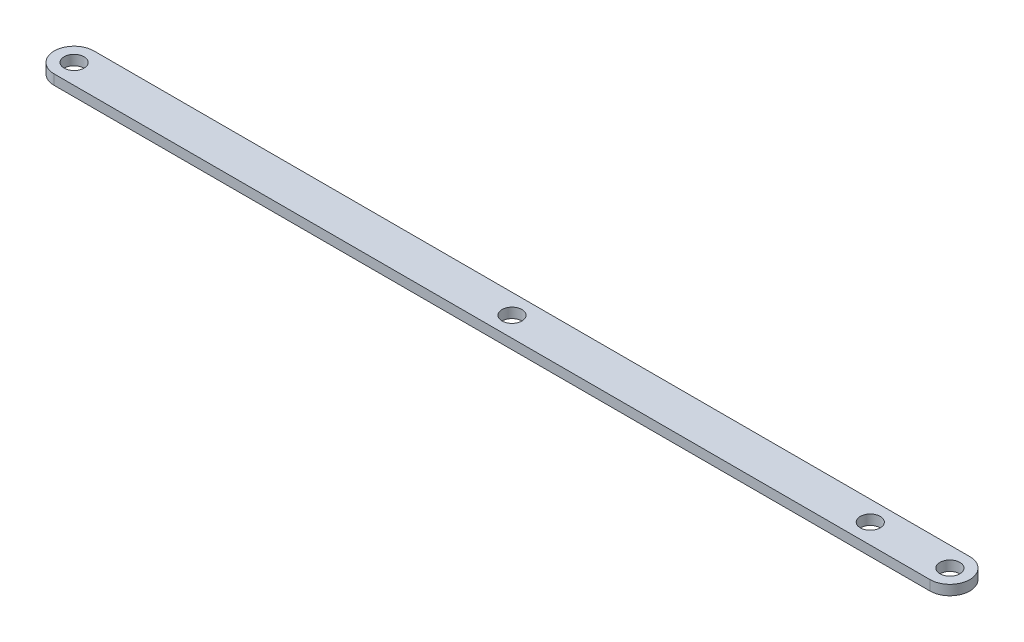
ISO-10303-21;
HEADER;
FILE_DESCRIPTION(('STEP AP214'),'2;1');
FILE_NAME('part.step','',(''),(''),'','','');
FILE_SCHEMA(('AUTOMOTIVE_DESIGN { 1 0 10303 214 1 1 1 1 }'));
ENDSEC;
DATA;
#1=APPLICATION_CONTEXT('core data for automotive mechanical design processes');
#2=APPLICATION_PROTOCOL_DEFINITION('international standard','automotive_design',2000,#1);
#3=PRODUCT_CONTEXT('',#1,'mechanical');
#4=PRODUCT('Part','Part','',(#3));
#5=PRODUCT_RELATED_PRODUCT_CATEGORY('part','',(#4));
#6=PRODUCT_DEFINITION_FORMATION('','',#4);
#7=PRODUCT_DEFINITION_CONTEXT('part definition',#1,'design');
#8=PRODUCT_DEFINITION('design','',#6,#7);
#9=PRODUCT_DEFINITION_SHAPE('','',#8);
#10=(LENGTH_UNIT() NAMED_UNIT(*) SI_UNIT(.MILLI.,.METRE.));
#11=(NAMED_UNIT(*) PLANE_ANGLE_UNIT() SI_UNIT($,.RADIAN.));
#12=(NAMED_UNIT(*) SI_UNIT($,.STERADIAN.) SOLID_ANGLE_UNIT());
#13=UNCERTAINTY_MEASURE_WITH_UNIT(LENGTH_MEASURE(1.E-05),#10,'distance_accuracy_value','');
#14=(GEOMETRIC_REPRESENTATION_CONTEXT(3) GLOBAL_UNCERTAINTY_ASSIGNED_CONTEXT((#13)) GLOBAL_UNIT_ASSIGNED_CONTEXT((#10,
#11,#12)) REPRESENTATION_CONTEXT('',''));
#15=CARTESIAN_POINT('',(0.,0.,0.));
#16=DIRECTION('',(0.,0.,1.));
#17=DIRECTION('',(1.,0.,0.));
#18=AXIS2_PLACEMENT_3D('',#15,#16,#17);
#19=CARTESIAN_POINT('',(-72.3468097091892,5.,0.));
#20=DIRECTION('',(0.,1.,0.));
#21=DIRECTION('',(0.,0.,1.));
#22=AXIS2_PLACEMENT_3D('',#19,#20,#21);
#23=PLANE('',#22);
#24=CARTESIAN_POINT('',(327.653190290811,5.,0.));
#25=DIRECTION('',(0.,1.,0.));
#26=DIRECTION('',(0.,0.,1.));
#27=AXIS2_PLACEMENT_3D('',#24,#25,#26);
#28=CIRCLE('',#27,4.99999999999999);
#29=CARTESIAN_POINT('',(327.653190290811,5.,4.99999999999999));
#30=VERTEX_POINT('',#29);
#31=EDGE_CURVE('E131',#30,#30,#28,.T.);
#32=ORIENTED_EDGE('',*,*,#31,.F.);
#33=EDGE_LOOP('',(#32));
#34=FACE_BOUND('',#33,.T.);
#35=CARTESIAN_POINT('',(147.653190290811,5.,0.));
#36=DIRECTION('',(0.,1.,0.));
#37=DIRECTION('',(0.,0.,1.));
#38=AXIS2_PLACEMENT_3D('',#35,#36,#37);
#39=CIRCLE('',#38,4.99999999999999);
#40=CARTESIAN_POINT('',(147.653190290811,5.,4.99999999999999));
#41=VERTEX_POINT('',#40);
#42=EDGE_CURVE('E139',#41,#41,#39,.T.);
#43=ORIENTED_EDGE('',*,*,#42,.F.);
#44=EDGE_LOOP('',(#43));
#45=FACE_BOUND('',#44,.T.);
#46=CARTESIAN_POINT('',(-72.3468097091892,5.,0.));
#47=DIRECTION('',(0.,1.,0.));
#48=DIRECTION('',(0.,0.,1.));
#49=AXIS2_PLACEMENT_3D('',#46,#47,#48);
#50=CIRCLE('',#49,5.);
#51=CARTESIAN_POINT('',(-72.3468097091892,5.,5.));
#52=VERTEX_POINT('',#51);
#53=EDGE_CURVE('E118',#52,#52,#50,.T.);
#54=ORIENTED_EDGE('',*,*,#53,.F.);
#55=EDGE_LOOP('',(#54));
#56=FACE_BOUND('',#55,.T.);
#57=CARTESIAN_POINT('',(-72.3468097091892,5.,0.));
#58=DIRECTION('',(0.,1.,0.));
#59=DIRECTION('',(0.,0.,1.));
#60=AXIS2_PLACEMENT_3D('',#57,#58,#59);
#61=CIRCLE('',#60,10.);
#62=CARTESIAN_POINT('',(-72.3468097091892,5.,-10.));
#63=VERTEX_POINT('',#62);
#64=CARTESIAN_POINT('',(-72.3468097091892,5.,10.));
#65=VERTEX_POINT('',#64);
#66=EDGE_CURVE('E97',#63,#65,#61,.T.);
#67=ORIENTED_EDGE('',*,*,#66,.T.);
#68=DIRECTION('',(1.,0.,0.));
#69=VECTOR('',#68,1.);
#70=CARTESIAN_POINT('',(-72.3468097091892,5.,10.));
#71=LINE('',#70,#69);
#72=CARTESIAN_POINT('',(367.653190290811,5.,10.));
#73=VERTEX_POINT('',#72);
#74=EDGE_CURVE('E92',#65,#73,#71,.T.);
#75=ORIENTED_EDGE('',*,*,#74,.T.);
#76=CARTESIAN_POINT('',(367.653190290811,5.,0.));
#77=DIRECTION('',(0.,1.,0.));
#78=DIRECTION('',(0.,0.,1.));
#79=AXIS2_PLACEMENT_3D('',#76,#77,#78);
#80=CIRCLE('',#79,10.);
#81=CARTESIAN_POINT('',(367.653190290811,5.,-10.));
#82=VERTEX_POINT('',#81);
#83=EDGE_CURVE('E95',#73,#82,#80,.T.);
#84=ORIENTED_EDGE('',*,*,#83,.T.);
#85=DIRECTION('',(-1.,0.,0.));
#86=VECTOR('',#85,1.);
#87=CARTESIAN_POINT('',(-72.3468097091892,5.,-10.));
#88=LINE('',#87,#86);
#89=EDGE_CURVE('E62',#82,#63,#88,.T.);
#90=ORIENTED_EDGE('',*,*,#89,.T.);
#91=EDGE_LOOP('',(#67,#75,#84,#90));
#92=FACE_BOUND('',#91,.T.);
#93=CARTESIAN_POINT('',(367.653190290811,5.,0.));
#94=DIRECTION('',(0.,1.,0.));
#95=DIRECTION('',(0.,0.,1.));
#96=AXIS2_PLACEMENT_3D('',#93,#94,#95);
#97=CIRCLE('',#96,4.99999999999999);
#98=CARTESIAN_POINT('',(367.653190290811,5.,4.99999999999999));
#99=VERTEX_POINT('',#98);
#100=EDGE_CURVE('E147',#99,#99,#97,.T.);
#101=ORIENTED_EDGE('',*,*,#100,.F.);
#102=EDGE_LOOP('',(#101));
#103=FACE_BOUND('',#102,.T.);
#104=ADVANCED_FACE('F42',(#34,#45,#56,#92,#103),#23,.T.);
#105=CARTESIAN_POINT('',(-72.3468097091892,0.,0.));
#106=DIRECTION('',(0.,1.,0.));
#107=DIRECTION('',(0.,0.,1.));
#108=AXIS2_PLACEMENT_3D('',#105,#106,#107);
#109=PLANE('',#108);
#110=CARTESIAN_POINT('',(327.653190290811,0.,0.));
#111=DIRECTION('',(0.,1.,0.));
#112=DIRECTION('',(0.,0.,1.));
#113=AXIS2_PLACEMENT_3D('',#110,#111,#112);
#114=CIRCLE('',#113,4.99999999999999);
#115=CARTESIAN_POINT('',(327.653190290811,0.,4.99999999999999));
#116=VERTEX_POINT('',#115);
#117=EDGE_CURVE('E46',#116,#116,#114,.T.);
#118=ORIENTED_EDGE('',*,*,#117,.T.);
#119=EDGE_LOOP('',(#118));
#120=FACE_BOUND('',#119,.T.);
#121=CARTESIAN_POINT('',(147.653190290811,0.,0.));
#122=DIRECTION('',(0.,1.,0.));
#123=DIRECTION('',(0.,0.,1.));
#124=AXIS2_PLACEMENT_3D('',#121,#122,#123);
#125=CIRCLE('',#124,4.99999999999999);
#126=CARTESIAN_POINT('',(147.653190290811,0.,4.99999999999999));
#127=VERTEX_POINT('',#126);
#128=EDGE_CURVE('E128',#127,#127,#125,.T.);
#129=ORIENTED_EDGE('',*,*,#128,.T.);
#130=EDGE_LOOP('',(#129));
#131=FACE_BOUND('',#130,.T.);
#132=CARTESIAN_POINT('',(-72.3468097091892,0.,0.));
#133=DIRECTION('',(0.,1.,0.));
#134=DIRECTION('',(0.,0.,1.));
#135=AXIS2_PLACEMENT_3D('',#132,#133,#134);
#136=CIRCLE('',#135,10.);
#137=CARTESIAN_POINT('',(-72.3468097091892,0.,-10.));
#138=VERTEX_POINT('',#137);
#139=CARTESIAN_POINT('',(-72.3468097091892,0.,10.));
#140=VERTEX_POINT('',#139);
#141=EDGE_CURVE('E114',#138,#140,#136,.T.);
#142=ORIENTED_EDGE('',*,*,#141,.F.);
#143=DIRECTION('',(-1.,0.,0.));
#144=VECTOR('',#143,1.);
#145=CARTESIAN_POINT('',(-72.3468097091892,0.,-10.));
#146=LINE('',#145,#144);
#147=CARTESIAN_POINT('',(367.653190290811,0.,-10.));
#148=VERTEX_POINT('',#147);
#149=EDGE_CURVE('E85',#148,#138,#146,.T.);
#150=ORIENTED_EDGE('',*,*,#149,.F.);
#151=CARTESIAN_POINT('',(367.653190290811,0.,0.));
#152=DIRECTION('',(0.,1.,0.));
#153=DIRECTION('',(0.,0.,1.));
#154=AXIS2_PLACEMENT_3D('',#151,#152,#153);
#155=CIRCLE('',#154,10.);
#156=CARTESIAN_POINT('',(367.653190290811,0.,10.));
#157=VERTEX_POINT('',#156);
#158=EDGE_CURVE('E79',#157,#148,#155,.T.);
#159=ORIENTED_EDGE('',*,*,#158,.F.);
#160=DIRECTION('',(1.,0.,0.));
#161=VECTOR('',#160,1.);
#162=CARTESIAN_POINT('',(-72.3468097091892,0.,10.));
#163=LINE('',#162,#161);
#164=EDGE_CURVE('E102',#140,#157,#163,.T.);
#165=ORIENTED_EDGE('',*,*,#164,.F.);
#166=EDGE_LOOP('',(#142,#150,#159,#165));
#167=FACE_BOUND('',#166,.T.);
#168=CARTESIAN_POINT('',(-72.3468097091892,0.,0.));
#169=DIRECTION('',(0.,1.,0.));
#170=DIRECTION('',(0.,0.,1.));
#171=AXIS2_PLACEMENT_3D('',#168,#169,#170);
#172=CIRCLE('',#171,5.);
#173=CARTESIAN_POINT('',(-72.3468097091892,0.,5.));
#174=VERTEX_POINT('',#173);
#175=EDGE_CURVE('E151',#174,#174,#172,.T.);
#176=ORIENTED_EDGE('',*,*,#175,.T.);
#177=EDGE_LOOP('',(#176));
#178=FACE_BOUND('',#177,.T.);
#179=CARTESIAN_POINT('',(367.653190290811,0.,0.));
#180=DIRECTION('',(0.,1.,0.));
#181=DIRECTION('',(0.,0.,1.));
#182=AXIS2_PLACEMENT_3D('',#179,#180,#181);
#183=CIRCLE('',#182,4.99999999999999);
#184=CARTESIAN_POINT('',(367.653190290811,0.,4.99999999999999));
#185=VERTEX_POINT('',#184);
#186=EDGE_CURVE('E137',#185,#185,#183,.T.);
#187=ORIENTED_EDGE('',*,*,#186,.T.);
#188=EDGE_LOOP('',(#187));
#189=FACE_BOUND('',#188,.T.);
#190=ADVANCED_FACE('F163',(#120,#131,#167,#178,#189),#109,.F.);
#191=CARTESIAN_POINT('',(-72.3468097091892,5.,0.));
#192=DIRECTION('',(0.,-1.,0.));
#193=DIRECTION('',(0.,0.,-1.));
#194=AXIS2_PLACEMENT_3D('',#191,#192,#193);
#195=CYLINDRICAL_SURFACE('',#194,10.);
#196=ORIENTED_EDGE('',*,*,#141,.T.);
#197=DIRECTION('',(0.,-1.,0.));
#198=VECTOR('',#197,1.);
#199=CARTESIAN_POINT('',(-72.3468097091892,5.,10.));
#200=LINE('',#199,#198);
#201=EDGE_CURVE('E11',#65,#140,#200,.T.);
#202=ORIENTED_EDGE('',*,*,#201,.F.);
#203=ORIENTED_EDGE('',*,*,#66,.F.);
#204=DIRECTION('',(0.,-1.,0.));
#205=VECTOR('',#204,1.);
#206=CARTESIAN_POINT('',(-72.3468097091892,5.,-10.));
#207=LINE('',#206,#205);
#208=EDGE_CURVE('E110',#63,#138,#207,.T.);
#209=ORIENTED_EDGE('',*,*,#208,.T.);
#210=EDGE_LOOP('',(#196,#202,#203,#209));
#211=FACE_BOUND('',#210,.T.);
#212=ADVANCED_FACE('F44',(#211),#195,.T.);
#213=CARTESIAN_POINT('',(-72.3468097091892,5.,10.));
#214=DIRECTION('',(0.,0.,-1.));
#215=DIRECTION('',(-1.,0.,0.));
#216=AXIS2_PLACEMENT_3D('',#213,#214,#215);
#217=PLANE('',#216);
#218=ORIENTED_EDGE('',*,*,#164,.T.);
#219=DIRECTION('',(0.,-1.,0.));
#220=VECTOR('',#219,1.);
#221=CARTESIAN_POINT('',(367.653190290811,5.,10.));
#222=LINE('',#221,#220);
#223=EDGE_CURVE('E53',#73,#157,#222,.T.);
#224=ORIENTED_EDGE('',*,*,#223,.F.);
#225=ORIENTED_EDGE('',*,*,#74,.F.);
#226=ORIENTED_EDGE('',*,*,#201,.T.);
#227=EDGE_LOOP('',(#218,#224,#225,#226));
#228=FACE_BOUND('',#227,.T.);
#229=ADVANCED_FACE('F101',(#228),#217,.F.);
#230=CARTESIAN_POINT('',(367.653190290811,5.,0.));
#231=DIRECTION('',(0.,-1.,0.));
#232=DIRECTION('',(0.,0.,-1.));
#233=AXIS2_PLACEMENT_3D('',#230,#231,#232);
#234=CYLINDRICAL_SURFACE('',#233,10.);
#235=ORIENTED_EDGE('',*,*,#158,.T.);
#236=DIRECTION('',(0.,-1.,0.));
#237=VECTOR('',#236,1.);
#238=CARTESIAN_POINT('',(367.653190290811,5.,-10.));
#239=LINE('',#238,#237);
#240=EDGE_CURVE('E104',#82,#148,#239,.T.);
#241=ORIENTED_EDGE('',*,*,#240,.F.);
#242=ORIENTED_EDGE('',*,*,#83,.F.);
#243=ORIENTED_EDGE('',*,*,#223,.T.);
#244=EDGE_LOOP('',(#235,#241,#242,#243));
#245=FACE_BOUND('',#244,.T.);
#246=ADVANCED_FACE('F106',(#245),#234,.T.);
#247=CARTESIAN_POINT('',(-72.3468097091892,5.,-10.));
#248=DIRECTION('',(0.,0.,1.));
#249=DIRECTION('',(1.,0.,0.));
#250=AXIS2_PLACEMENT_3D('',#247,#248,#249);
#251=PLANE('',#250);
#252=ORIENTED_EDGE('',*,*,#149,.T.);
#253=ORIENTED_EDGE('',*,*,#208,.F.);
#254=ORIENTED_EDGE('',*,*,#89,.F.);
#255=ORIENTED_EDGE('',*,*,#240,.T.);
#256=EDGE_LOOP('',(#252,#253,#254,#255));
#257=FACE_BOUND('',#256,.T.);
#258=ADVANCED_FACE('F169',(#257),#251,.F.);
#259=CARTESIAN_POINT('',(-72.3468097091892,5.,0.));
#260=DIRECTION('',(0.,-1.,0.));
#261=DIRECTION('',(0.,0.,-1.));
#262=AXIS2_PLACEMENT_3D('',#259,#260,#261);
#263=CYLINDRICAL_SURFACE('',#262,5.);
#264=ORIENTED_EDGE('',*,*,#53,.T.);
#265=EDGE_LOOP('',(#264));
#266=FACE_BOUND('',#265,.T.);
#267=ORIENTED_EDGE('',*,*,#175,.F.);
#268=EDGE_LOOP('',(#267));
#269=FACE_BOUND('',#268,.T.);
#270=ADVANCED_FACE('F166',(#266,#269),#263,.F.);
#271=CARTESIAN_POINT('',(367.653190290811,5.,0.));
#272=DIRECTION('',(0.,-1.,0.));
#273=DIRECTION('',(0.,0.,-1.));
#274=AXIS2_PLACEMENT_3D('',#271,#272,#273);
#275=CYLINDRICAL_SURFACE('',#274,4.99999999999999);
#276=ORIENTED_EDGE('',*,*,#100,.T.);
#277=EDGE_LOOP('',(#276));
#278=FACE_BOUND('',#277,.T.);
#279=ORIENTED_EDGE('',*,*,#186,.F.);
#280=EDGE_LOOP('',(#279));
#281=FACE_BOUND('',#280,.T.);
#282=ADVANCED_FACE('F168',(#278,#281),#275,.F.);
#283=CARTESIAN_POINT('',(147.653190290811,-5.,0.));
#284=DIRECTION('',(0.,1.,0.));
#285=DIRECTION('',(0.,0.,1.));
#286=AXIS2_PLACEMENT_3D('',#283,#284,#285);
#287=CYLINDRICAL_SURFACE('',#286,4.99999999999999);
#288=ORIENTED_EDGE('',*,*,#42,.T.);
#289=EDGE_LOOP('',(#288));
#290=FACE_BOUND('',#289,.T.);
#291=ORIENTED_EDGE('',*,*,#128,.F.);
#292=EDGE_LOOP('',(#291));
#293=FACE_BOUND('',#292,.T.);
#294=ADVANCED_FACE('F176',(#290,#293),#287,.F.);
#295=CARTESIAN_POINT('',(327.653190290811,-5.,0.));
#296=DIRECTION('',(0.,1.,0.));
#297=DIRECTION('',(0.,0.,1.));
#298=AXIS2_PLACEMENT_3D('',#295,#296,#297);
#299=CYLINDRICAL_SURFACE('',#298,4.99999999999999);
#300=ORIENTED_EDGE('',*,*,#31,.T.);
#301=EDGE_LOOP('',(#300));
#302=FACE_BOUND('',#301,.T.);
#303=ORIENTED_EDGE('',*,*,#117,.F.);
#304=EDGE_LOOP('',(#303));
#305=FACE_BOUND('',#304,.T.);
#306=ADVANCED_FACE('F218',(#302,#305),#299,.F.);
#307=CLOSED_SHELL('',(#104,#190,#212,#229,#246,#258,#270,#282,#294,#306));
#308=MANIFOLD_SOLID_BREP('B2',#307);
#309=ADVANCED_BREP_SHAPE_REPRESENTATION('',(#18,#308),#14);
#310=SHAPE_DEFINITION_REPRESENTATION(#9,#309);
ENDSEC;
END-ISO-10303-21;
